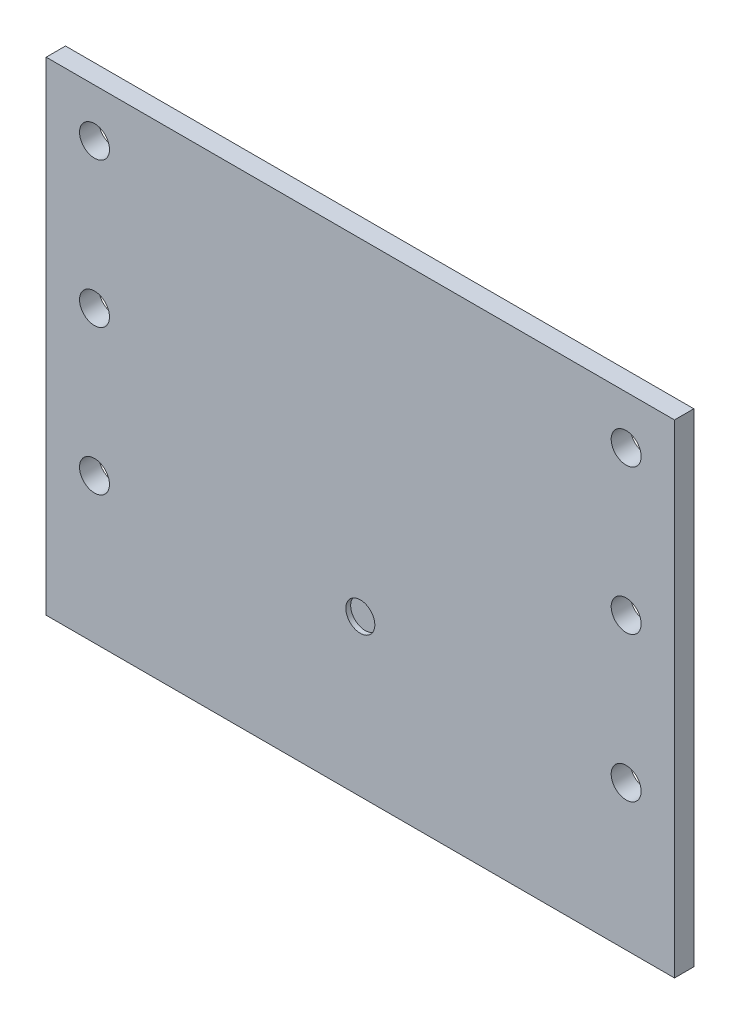
ISO-10303-21;
HEADER;
FILE_DESCRIPTION(('STEP AP214'),'2;1');
FILE_NAME('part.step','',(''),(''),'','','');
FILE_SCHEMA(('AUTOMOTIVE_DESIGN { 1 0 10303 214 1 1 1 1 }'));
ENDSEC;
DATA;
#1=APPLICATION_CONTEXT('core data for automotive mechanical design processes');
#2=APPLICATION_PROTOCOL_DEFINITION('international standard','automotive_design',2000,#1);
#3=PRODUCT_CONTEXT('',#1,'mechanical');
#4=PRODUCT('Part','Part','',(#3));
#5=PRODUCT_RELATED_PRODUCT_CATEGORY('part','',(#4));
#6=PRODUCT_DEFINITION_FORMATION('','',#4);
#7=PRODUCT_DEFINITION_CONTEXT('part definition',#1,'design');
#8=PRODUCT_DEFINITION('design','',#6,#7);
#9=PRODUCT_DEFINITION_SHAPE('','',#8);
#10=(LENGTH_UNIT() NAMED_UNIT(*) SI_UNIT(.MILLI.,.METRE.));
#11=(NAMED_UNIT(*) PLANE_ANGLE_UNIT() SI_UNIT($,.RADIAN.));
#12=(NAMED_UNIT(*) SI_UNIT($,.STERADIAN.) SOLID_ANGLE_UNIT());
#13=UNCERTAINTY_MEASURE_WITH_UNIT(LENGTH_MEASURE(1.E-05),#10,'distance_accuracy_value','');
#14=(GEOMETRIC_REPRESENTATION_CONTEXT(3) GLOBAL_UNCERTAINTY_ASSIGNED_CONTEXT((#13)) GLOBAL_UNIT_ASSIGNED_CONTEXT((#10,
#11,#12)) REPRESENTATION_CONTEXT('',''));
#15=CARTESIAN_POINT('',(0.,0.,0.));
#16=DIRECTION('',(0.,0.,1.));
#17=DIRECTION('',(1.,0.,0.));
#18=AXIS2_PLACEMENT_3D('',#15,#16,#17);
#19=CARTESIAN_POINT('',(0.,0.,4.));
#20=DIRECTION('',(0.,0.,1.));
#21=DIRECTION('',(1.,0.,0.));
#22=AXIS2_PLACEMENT_3D('',#19,#20,#21);
#23=PLANE('',#22);
#24=CARTESIAN_POINT('',(-55.,40.,4.));
#25=DIRECTION('',(0.,0.,1.));
#26=DIRECTION('',(1.,0.,0.));
#27=AXIS2_PLACEMENT_3D('',#24,#25,#26);
#28=CIRCLE('',#27,3.09999999999999);
#29=CARTESIAN_POINT('',(-51.9,40.,4.));
#30=VERTEX_POINT('',#29);
#31=EDGE_CURVE('E136',#30,#30,#28,.T.);
#32=ORIENTED_EDGE('',*,*,#31,.F.);
#33=EDGE_LOOP('',(#32));
#34=FACE_BOUND('',#33,.T.);
#35=CARTESIAN_POINT('',(-55.,-20.,4.));
#36=DIRECTION('',(0.,0.,1.));
#37=DIRECTION('',(1.,0.,0.));
#38=AXIS2_PLACEMENT_3D('',#35,#36,#37);
#39=CIRCLE('',#38,3.1);
#40=CARTESIAN_POINT('',(-51.9,-20.,4.));
#41=VERTEX_POINT('',#40);
#42=EDGE_CURVE('E144',#41,#41,#39,.T.);
#43=ORIENTED_EDGE('',*,*,#42,.F.);
#44=EDGE_LOOP('',(#43));
#45=FACE_BOUND('',#44,.T.);
#46=CARTESIAN_POINT('',(55.,10.,4.));
#47=DIRECTION('',(0.,0.,1.));
#48=DIRECTION('',(1.,0.,0.));
#49=AXIS2_PLACEMENT_3D('',#46,#47,#48);
#50=CIRCLE('',#49,3.1);
#51=CARTESIAN_POINT('',(58.1,10.,4.));
#52=VERTEX_POINT('',#51);
#53=EDGE_CURVE('E137',#52,#52,#50,.F.);
#54=ORIENTED_EDGE('',*,*,#53,.T.);
#55=EDGE_LOOP('',(#54));
#56=FACE_BOUND('',#55,.T.);
#57=CARTESIAN_POINT('',(2.70618596975858E-10,-17.7375848968262,4.));
#58=DIRECTION('',(0.,0.,1.));
#59=DIRECTION('',(1.,0.,0.));
#60=AXIS2_PLACEMENT_3D('',#57,#58,#59);
#61=CIRCLE('',#60,3.);
#62=CARTESIAN_POINT('',(3.00000000027062,-17.7375848968262,4.));
#63=VERTEX_POINT('',#62);
#64=EDGE_CURVE('E104',#63,#63,#61,.T.);
#65=ORIENTED_EDGE('',*,*,#64,.F.);
#66=EDGE_LOOP('',(#65));
#67=FACE_BOUND('',#66,.T.);
#68=CARTESIAN_POINT('',(-55.,10.,4.));
#69=DIRECTION('',(0.,0.,1.));
#70=DIRECTION('',(1.,0.,0.));
#71=AXIS2_PLACEMENT_3D('',#68,#69,#70);
#72=CIRCLE('',#71,3.1);
#73=CARTESIAN_POINT('',(-51.9,10.,4.));
#74=VERTEX_POINT('',#73);
#75=EDGE_CURVE('E114',#74,#74,#72,.T.);
#76=ORIENTED_EDGE('',*,*,#75,.F.);
#77=EDGE_LOOP('',(#76));
#78=FACE_BOUND('',#77,.T.);
#79=CARTESIAN_POINT('',(55.,-20.,4.));
#80=DIRECTION('',(0.,0.,1.));
#81=DIRECTION('',(1.,0.,0.));
#82=AXIS2_PLACEMENT_3D('',#79,#80,#81);
#83=CIRCLE('',#82,3.1);
#84=CARTESIAN_POINT('',(58.1,-20.,4.));
#85=VERTEX_POINT('',#84);
#86=EDGE_CURVE('E141',#85,#85,#83,.F.);
#87=ORIENTED_EDGE('',*,*,#86,.T.);
#88=EDGE_LOOP('',(#87));
#89=FACE_BOUND('',#88,.T.);
#90=CARTESIAN_POINT('',(55.,40.,4.));
#91=DIRECTION('',(0.,0.,1.));
#92=DIRECTION('',(1.,0.,0.));
#93=AXIS2_PLACEMENT_3D('',#90,#91,#92);
#94=CIRCLE('',#93,3.09999999999999);
#95=CARTESIAN_POINT('',(58.1,40.,4.));
#96=VERTEX_POINT('',#95);
#97=EDGE_CURVE('E140',#96,#96,#94,.F.);
#98=ORIENTED_EDGE('',*,*,#97,.T.);
#99=EDGE_LOOP('',(#98));
#100=FACE_BOUND('',#99,.T.);
#101=DIRECTION('',(-1.,0.,0.));
#102=VECTOR('',#101,1.);
#103=CARTESIAN_POINT('',(-105.,50.,4.));
#104=LINE('',#103,#102);
#105=CARTESIAN_POINT('',(65.,50.,4.));
#106=VERTEX_POINT('',#105);
#107=CARTESIAN_POINT('',(-65.,50.,4.));
#108=VERTEX_POINT('',#107);
#109=EDGE_CURVE('E101',#106,#108,#104,.T.);
#110=ORIENTED_EDGE('',*,*,#109,.T.);
#111=DIRECTION('',(0.,-1.,0.));
#112=VECTOR('',#111,1.);
#113=CARTESIAN_POINT('',(-65.,0.,4.));
#114=LINE('',#113,#112);
#115=CARTESIAN_POINT('',(-65.,-50.,4.));
#116=VERTEX_POINT('',#115);
#117=EDGE_CURVE('E81',#108,#116,#114,.T.);
#118=ORIENTED_EDGE('',*,*,#117,.T.);
#119=DIRECTION('',(1.,0.,0.));
#120=VECTOR('',#119,1.);
#121=CARTESIAN_POINT('',(-105.,-50.,4.));
#122=LINE('',#121,#120);
#123=CARTESIAN_POINT('',(65.,-50.,4.));
#124=VERTEX_POINT('',#123);
#125=EDGE_CURVE('E107',#116,#124,#122,.T.);
#126=ORIENTED_EDGE('',*,*,#125,.T.);
#127=DIRECTION('',(0.,1.,0.));
#128=VECTOR('',#127,1.);
#129=CARTESIAN_POINT('',(65.,0.,4.));
#130=LINE('',#129,#128);
#131=EDGE_CURVE('E55',#124,#106,#130,.T.);
#132=ORIENTED_EDGE('',*,*,#131,.T.);
#133=EDGE_LOOP('',(#110,#118,#126,#132));
#134=FACE_BOUND('',#133,.T.);
#135=ADVANCED_FACE('F40',(#34,#45,#56,#67,#78,#89,#100,#134),#23,.T.);
#136=CARTESIAN_POINT('',(0.,0.,0.));
#137=DIRECTION('',(0.,0.,1.));
#138=DIRECTION('',(1.,0.,0.));
#139=AXIS2_PLACEMENT_3D('',#136,#137,#138);
#140=PLANE('',#139);
#141=CARTESIAN_POINT('',(-55.,40.,0.));
#142=DIRECTION('',(0.,0.,1.));
#143=DIRECTION('',(1.,0.,0.));
#144=AXIS2_PLACEMENT_3D('',#141,#142,#143);
#145=CIRCLE('',#144,3.09999999999999);
#146=CARTESIAN_POINT('',(-51.9,40.,0.));
#147=VERTEX_POINT('',#146);
#148=EDGE_CURVE('E126',#147,#147,#145,.T.);
#149=ORIENTED_EDGE('',*,*,#148,.T.);
#150=EDGE_LOOP('',(#149));
#151=FACE_BOUND('',#150,.T.);
#152=CARTESIAN_POINT('',(-55.,-20.,0.));
#153=DIRECTION('',(0.,0.,1.));
#154=DIRECTION('',(1.,0.,0.));
#155=AXIS2_PLACEMENT_3D('',#152,#153,#154);
#156=CIRCLE('',#155,3.1);
#157=CARTESIAN_POINT('',(-51.9,-20.,0.));
#158=VERTEX_POINT('',#157);
#159=EDGE_CURVE('E123',#158,#158,#156,.T.);
#160=ORIENTED_EDGE('',*,*,#159,.T.);
#161=EDGE_LOOP('',(#160));
#162=FACE_BOUND('',#161,.T.);
#163=CARTESIAN_POINT('',(-55.,10.,0.));
#164=DIRECTION('',(0.,0.,1.));
#165=DIRECTION('',(1.,0.,0.));
#166=AXIS2_PLACEMENT_3D('',#163,#164,#165);
#167=CIRCLE('',#166,3.1);
#168=CARTESIAN_POINT('',(-51.9,10.,0.));
#169=VERTEX_POINT('',#168);
#170=EDGE_CURVE('E110',#169,#169,#167,.T.);
#171=ORIENTED_EDGE('',*,*,#170,.T.);
#172=EDGE_LOOP('',(#171));
#173=FACE_BOUND('',#172,.T.);
#174=CARTESIAN_POINT('',(55.,-20.,0.));
#175=DIRECTION('',(0.,0.,1.));
#176=DIRECTION('',(1.,0.,0.));
#177=AXIS2_PLACEMENT_3D('',#174,#175,#176);
#178=CIRCLE('',#177,3.1);
#179=CARTESIAN_POINT('',(58.1,-20.,0.));
#180=VERTEX_POINT('',#179);
#181=EDGE_CURVE('E113',#180,#180,#178,.F.);
#182=ORIENTED_EDGE('',*,*,#181,.F.);
#183=EDGE_LOOP('',(#182));
#184=FACE_BOUND('',#183,.T.);
#185=CARTESIAN_POINT('',(55.,10.,0.));
#186=DIRECTION('',(0.,0.,1.));
#187=DIRECTION('',(1.,0.,0.));
#188=AXIS2_PLACEMENT_3D('',#185,#186,#187);
#189=CIRCLE('',#188,3.1);
#190=CARTESIAN_POINT('',(58.1,10.,0.));
#191=VERTEX_POINT('',#190);
#192=EDGE_CURVE('E117',#191,#191,#189,.F.);
#193=ORIENTED_EDGE('',*,*,#192,.F.);
#194=EDGE_LOOP('',(#193));
#195=FACE_BOUND('',#194,.T.);
#196=CARTESIAN_POINT('',(55.,40.,0.));
#197=DIRECTION('',(0.,0.,1.));
#198=DIRECTION('',(1.,0.,0.));
#199=AXIS2_PLACEMENT_3D('',#196,#197,#198);
#200=CIRCLE('',#199,3.09999999999999);
#201=CARTESIAN_POINT('',(58.1,40.,0.));
#202=VERTEX_POINT('',#201);
#203=EDGE_CURVE('E120',#202,#202,#200,.F.);
#204=ORIENTED_EDGE('',*,*,#203,.F.);
#205=EDGE_LOOP('',(#204));
#206=FACE_BOUND('',#205,.T.);
#207=DIRECTION('',(0.,1.,0.));
#208=VECTOR('',#207,1.);
#209=CARTESIAN_POINT('',(-65.,50.,0.));
#210=LINE('',#209,#208);
#211=CARTESIAN_POINT('',(-65.,-50.,0.));
#212=VERTEX_POINT('',#211);
#213=CARTESIAN_POINT('',(-65.,50.,0.));
#214=VERTEX_POINT('',#213);
#215=EDGE_CURVE('E62',#212,#214,#210,.T.);
#216=ORIENTED_EDGE('',*,*,#215,.T.);
#217=DIRECTION('',(-1.,0.,0.));
#218=VECTOR('',#217,1.);
#219=CARTESIAN_POINT('',(-105.,50.,0.));
#220=LINE('',#219,#218);
#221=CARTESIAN_POINT('',(65.,50.,0.));
#222=VERTEX_POINT('',#221);
#223=EDGE_CURVE('E94',#222,#214,#220,.T.);
#224=ORIENTED_EDGE('',*,*,#223,.F.);
#225=DIRECTION('',(0.,-1.,0.));
#226=VECTOR('',#225,1.);
#227=CARTESIAN_POINT('',(65.,50.,0.));
#228=LINE('',#227,#226);
#229=CARTESIAN_POINT('',(65.,-50.,0.));
#230=VERTEX_POINT('',#229);
#231=EDGE_CURVE('E86',#222,#230,#228,.T.);
#232=ORIENTED_EDGE('',*,*,#231,.T.);
#233=DIRECTION('',(1.,0.,0.));
#234=VECTOR('',#233,1.);
#235=CARTESIAN_POINT('',(-105.,-50.,0.));
#236=LINE('',#235,#234);
#237=EDGE_CURVE('E96',#212,#230,#236,.T.);
#238=ORIENTED_EDGE('',*,*,#237,.F.);
#239=EDGE_LOOP('',(#216,#224,#232,#238));
#240=FACE_BOUND('',#239,.T.);
#241=ADVANCED_FACE('F92',(#151,#162,#173,#184,#195,#206,#240),#140,.F.);
#242=CARTESIAN_POINT('',(-105.,50.,4.));
#243=DIRECTION('',(0.,-1.,0.));
#244=DIRECTION('',(0.,0.,-1.));
#245=AXIS2_PLACEMENT_3D('',#242,#243,#244);
#246=PLANE('',#245);
#247=DIRECTION('',(0.,0.,-1.));
#248=VECTOR('',#247,1.);
#249=CARTESIAN_POINT('',(-65.,50.,100.));
#250=LINE('',#249,#248);
#251=EDGE_CURVE('E78',#108,#214,#250,.T.);
#252=ORIENTED_EDGE('',*,*,#251,.F.);
#253=ORIENTED_EDGE('',*,*,#109,.F.);
#254=DIRECTION('',(0.,0.,-1.));
#255=VECTOR('',#254,1.);
#256=CARTESIAN_POINT('',(65.,50.,100.));
#257=LINE('',#256,#255);
#258=EDGE_CURVE('E87',#106,#222,#257,.T.);
#259=ORIENTED_EDGE('',*,*,#258,.T.);
#260=ORIENTED_EDGE('',*,*,#223,.T.);
#261=EDGE_LOOP('',(#252,#253,#259,#260));
#262=FACE_BOUND('',#261,.T.);
#263=ADVANCED_FACE('F42',(#262),#246,.F.);
#264=CARTESIAN_POINT('',(-105.,-50.,4.));
#265=DIRECTION('',(0.,1.,0.));
#266=DIRECTION('',(0.,0.,1.));
#267=AXIS2_PLACEMENT_3D('',#264,#265,#266);
#268=PLANE('',#267);
#269=DIRECTION('',(0.,0.,1.));
#270=VECTOR('',#269,1.);
#271=CARTESIAN_POINT('',(-65.,-50.,4.));
#272=LINE('',#271,#270);
#273=EDGE_CURVE('E12',#212,#116,#272,.T.);
#274=ORIENTED_EDGE('',*,*,#273,.F.);
#275=ORIENTED_EDGE('',*,*,#237,.T.);
#276=DIRECTION('',(0.,0.,-1.));
#277=VECTOR('',#276,1.);
#278=CARTESIAN_POINT('',(65.,-50.,4.));
#279=LINE('',#278,#277);
#280=EDGE_CURVE('E48',#124,#230,#279,.T.);
#281=ORIENTED_EDGE('',*,*,#280,.F.);
#282=ORIENTED_EDGE('',*,*,#125,.F.);
#283=EDGE_LOOP('',(#274,#275,#281,#282));
#284=FACE_BOUND('',#283,.T.);
#285=ADVANCED_FACE('F155',(#284),#268,.F.);
#286=CARTESIAN_POINT('',(2.70618596975858E-10,-17.7375848968262,2.99999999999999));
#287=DIRECTION('',(0.,0.,1.));
#288=DIRECTION('',(1.,0.,0.));
#289=AXIS2_PLACEMENT_3D('',#286,#287,#288);
#290=CYLINDRICAL_SURFACE('',#289,3.);
#291=CARTESIAN_POINT('',(2.70618596975858E-10,-17.7375848968262,2.99999999999999));
#292=DIRECTION('',(0.,0.,1.));
#293=DIRECTION('',(1.,0.,0.));
#294=AXIS2_PLACEMENT_3D('',#291,#292,#293);
#295=CIRCLE('',#294,3.);
#296=CARTESIAN_POINT('',(3.00000000027062,-17.7375848968262,2.99999999999999));
#297=VERTEX_POINT('',#296);
#298=EDGE_CURVE('E99',#297,#297,#295,.T.);
#299=ORIENTED_EDGE('',*,*,#298,.F.);
#300=EDGE_LOOP('',(#299));
#301=FACE_BOUND('',#300,.T.);
#302=ORIENTED_EDGE('',*,*,#64,.T.);
#303=EDGE_LOOP('',(#302));
#304=FACE_BOUND('',#303,.T.);
#305=ADVANCED_FACE('F167',(#301,#304),#290,.F.);
#306=CARTESIAN_POINT('',(2.70618596975858E-10,-17.7375848968262,2.99999999999999));
#307=DIRECTION('',(0.,0.,1.));
#308=DIRECTION('',(1.,0.,0.));
#309=AXIS2_PLACEMENT_3D('',#306,#307,#308);
#310=PLANE('',#309);
#311=ORIENTED_EDGE('',*,*,#298,.T.);
#312=EDGE_LOOP('',(#311));
#313=FACE_BOUND('',#312,.T.);
#314=ADVANCED_FACE('F174',(#313),#310,.T.);
#315=CARTESIAN_POINT('',(-55.,10.,-56.));
#316=DIRECTION('',(0.,0.,1.));
#317=DIRECTION('',(1.,0.,0.));
#318=AXIS2_PLACEMENT_3D('',#315,#316,#317);
#319=CYLINDRICAL_SURFACE('',#318,3.1);
#320=ORIENTED_EDGE('',*,*,#75,.T.);
#321=EDGE_LOOP('',(#320));
#322=FACE_BOUND('',#321,.T.);
#323=ORIENTED_EDGE('',*,*,#170,.F.);
#324=EDGE_LOOP('',(#323));
#325=FACE_BOUND('',#324,.T.);
#326=ADVANCED_FACE('F245',(#322,#325),#319,.F.);
#327=CARTESIAN_POINT('',(55.,-20.,-56.));
#328=DIRECTION('',(0.,0.,1.));
#329=DIRECTION('',(1.,0.,0.));
#330=AXIS2_PLACEMENT_3D('',#327,#328,#329);
#331=CYLINDRICAL_SURFACE('',#330,3.1);
#332=ORIENTED_EDGE('',*,*,#86,.F.);
#333=EDGE_LOOP('',(#332));
#334=FACE_BOUND('',#333,.T.);
#335=ORIENTED_EDGE('',*,*,#181,.T.);
#336=EDGE_LOOP('',(#335));
#337=FACE_BOUND('',#336,.T.);
#338=ADVANCED_FACE('F234',(#334,#337),#331,.F.);
#339=CARTESIAN_POINT('',(55.,10.,-56.));
#340=DIRECTION('',(0.,0.,1.));
#341=DIRECTION('',(1.,0.,0.));
#342=AXIS2_PLACEMENT_3D('',#339,#340,#341);
#343=CYLINDRICAL_SURFACE('',#342,3.1);
#344=ORIENTED_EDGE('',*,*,#53,.F.);
#345=EDGE_LOOP('',(#344));
#346=FACE_BOUND('',#345,.T.);
#347=ORIENTED_EDGE('',*,*,#192,.T.);
#348=EDGE_LOOP('',(#347));
#349=FACE_BOUND('',#348,.T.);
#350=ADVANCED_FACE('F223',(#346,#349),#343,.F.);
#351=CARTESIAN_POINT('',(55.,40.,-56.));
#352=DIRECTION('',(0.,0.,1.));
#353=DIRECTION('',(1.,0.,0.));
#354=AXIS2_PLACEMENT_3D('',#351,#352,#353);
#355=CYLINDRICAL_SURFACE('',#354,3.09999999999999);
#356=ORIENTED_EDGE('',*,*,#97,.F.);
#357=EDGE_LOOP('',(#356));
#358=FACE_BOUND('',#357,.T.);
#359=ORIENTED_EDGE('',*,*,#203,.T.);
#360=EDGE_LOOP('',(#359));
#361=FACE_BOUND('',#360,.T.);
#362=ADVANCED_FACE('F212',(#358,#361),#355,.F.);
#363=CARTESIAN_POINT('',(-55.,-20.,-56.));
#364=DIRECTION('',(0.,0.,1.));
#365=DIRECTION('',(1.,0.,0.));
#366=AXIS2_PLACEMENT_3D('',#363,#364,#365);
#367=CYLINDRICAL_SURFACE('',#366,3.1);
#368=ORIENTED_EDGE('',*,*,#42,.T.);
#369=EDGE_LOOP('',(#368));
#370=FACE_BOUND('',#369,.T.);
#371=ORIENTED_EDGE('',*,*,#159,.F.);
#372=EDGE_LOOP('',(#371));
#373=FACE_BOUND('',#372,.T.);
#374=ADVANCED_FACE('F199',(#370,#373),#367,.F.);
#375=CARTESIAN_POINT('',(-55.,40.,-56.));
#376=DIRECTION('',(0.,0.,1.));
#377=DIRECTION('',(1.,0.,0.));
#378=AXIS2_PLACEMENT_3D('',#375,#376,#377);
#379=CYLINDRICAL_SURFACE('',#378,3.09999999999999);
#380=ORIENTED_EDGE('',*,*,#31,.T.);
#381=EDGE_LOOP('',(#380));
#382=FACE_BOUND('',#381,.T.);
#383=ORIENTED_EDGE('',*,*,#148,.F.);
#384=EDGE_LOOP('',(#383));
#385=FACE_BOUND('',#384,.T.);
#386=ADVANCED_FACE('F193',(#382,#385),#379,.F.);
#387=CARTESIAN_POINT('',(65.,50.,100.));
#388=DIRECTION('',(1.,0.,0.));
#389=DIRECTION('',(0.,0.,-1.));
#390=AXIS2_PLACEMENT_3D('',#387,#388,#389);
#391=PLANE('',#390);
#392=ORIENTED_EDGE('',*,*,#280,.T.);
#393=ORIENTED_EDGE('',*,*,#231,.F.);
#394=ORIENTED_EDGE('',*,*,#258,.F.);
#395=ORIENTED_EDGE('',*,*,#131,.F.);
#396=EDGE_LOOP('',(#392,#393,#394,#395));
#397=FACE_BOUND('',#396,.T.);
#398=ADVANCED_FACE('F198',(#397),#391,.T.);
#399=CARTESIAN_POINT('',(-65.,50.,100.));
#400=DIRECTION('',(-1.,0.,0.));
#401=DIRECTION('',(0.,0.,1.));
#402=AXIS2_PLACEMENT_3D('',#399,#400,#401);
#403=PLANE('',#402);
#404=ORIENTED_EDGE('',*,*,#251,.T.);
#405=ORIENTED_EDGE('',*,*,#215,.F.);
#406=ORIENTED_EDGE('',*,*,#273,.T.);
#407=ORIENTED_EDGE('',*,*,#117,.F.);
#408=EDGE_LOOP('',(#404,#405,#406,#407));
#409=FACE_BOUND('',#408,.T.);
#410=ADVANCED_FACE('F79',(#409),#403,.T.);
#411=CLOSED_SHELL('',(#135,#241,#263,#285,#305,#314,#326,#338,#350,#362,#374,#386,#398,#410));
#412=MANIFOLD_SOLID_BREP('B2',#411);
#413=ADVANCED_BREP_SHAPE_REPRESENTATION('',(#18,#412),#14);
#414=SHAPE_DEFINITION_REPRESENTATION(#9,#413);
ENDSEC;
END-ISO-10303-21;
